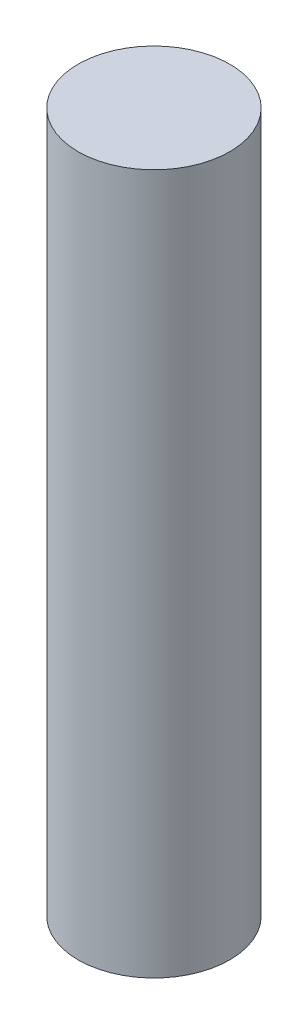
ISO-10303-21;
HEADER;
FILE_DESCRIPTION(('STEP AP214'),'2;1');
FILE_NAME('part.step','',(''),(''),'','','');
FILE_SCHEMA(('AUTOMOTIVE_DESIGN { 1 0 10303 214 1 1 1 1 }'));
ENDSEC;
DATA;
#1=APPLICATION_CONTEXT('core data for automotive mechanical design processes');
#2=APPLICATION_PROTOCOL_DEFINITION('international standard','automotive_design',2000,#1);
#3=PRODUCT_CONTEXT('',#1,'mechanical');
#4=PRODUCT('Part','Part','',(#3));
#5=PRODUCT_RELATED_PRODUCT_CATEGORY('part','',(#4));
#6=PRODUCT_DEFINITION_FORMATION('','',#4);
#7=PRODUCT_DEFINITION_CONTEXT('part definition',#1,'design');
#8=PRODUCT_DEFINITION('design','',#6,#7);
#9=PRODUCT_DEFINITION_SHAPE('','',#8);
#10=(LENGTH_UNIT() NAMED_UNIT(*) SI_UNIT(.MILLI.,.METRE.));
#11=(NAMED_UNIT(*) PLANE_ANGLE_UNIT() SI_UNIT($,.RADIAN.));
#12=(NAMED_UNIT(*) SI_UNIT($,.STERADIAN.) SOLID_ANGLE_UNIT());
#13=UNCERTAINTY_MEASURE_WITH_UNIT(LENGTH_MEASURE(1.E-05),#10,'distance_accuracy_value','');
#14=(GEOMETRIC_REPRESENTATION_CONTEXT(3) GLOBAL_UNCERTAINTY_ASSIGNED_CONTEXT((#13)) GLOBAL_UNIT_ASSIGNED_CONTEXT((#10,
#11,#12)) REPRESENTATION_CONTEXT('',''));
#15=CARTESIAN_POINT('',(0.,0.,0.));
#16=DIRECTION('',(0.,0.,1.));
#17=DIRECTION('',(1.,0.,0.));
#18=AXIS2_PLACEMENT_3D('',#15,#16,#17);
#19=CARTESIAN_POINT('',(0.,30.,0.));
#20=DIRECTION('',(0.,-1.,0.));
#21=DIRECTION('',(0.,0.,-1.));
#22=AXIS2_PLACEMENT_3D('',#19,#20,#21);
#23=CYLINDRICAL_SURFACE('',#22,3.25);
#24=CARTESIAN_POINT('',(0.,30.,0.));
#25=DIRECTION('',(0.,1.,0.));
#26=DIRECTION('',(0.,0.,1.));
#27=AXIS2_PLACEMENT_3D('',#24,#25,#26);
#28=CIRCLE('',#27,3.25);
#29=CARTESIAN_POINT('',(0.,30.,3.25));
#30=VERTEX_POINT('',#29);
#31=EDGE_CURVE('E10',#30,#30,#28,.T.);
#32=ORIENTED_EDGE('',*,*,#31,.F.);
#33=EDGE_LOOP('',(#32));
#34=FACE_BOUND('',#33,.T.);
#35=CARTESIAN_POINT('',(0.,0.,0.));
#36=DIRECTION('',(0.,1.,0.));
#37=DIRECTION('',(0.,0.,1.));
#38=AXIS2_PLACEMENT_3D('',#35,#36,#37);
#39=CIRCLE('',#38,3.25);
#40=CARTESIAN_POINT('',(0.,0.,3.25));
#41=VERTEX_POINT('',#40);
#42=EDGE_CURVE('E34',#41,#41,#39,.T.);
#43=ORIENTED_EDGE('',*,*,#42,.T.);
#44=EDGE_LOOP('',(#43));
#45=FACE_BOUND('',#44,.T.);
#46=ADVANCED_FACE('F31',(#34,#45),#23,.T.);
#47=CARTESIAN_POINT('',(0.,30.,0.));
#48=DIRECTION('',(0.,1.,0.));
#49=DIRECTION('',(0.,0.,1.));
#50=AXIS2_PLACEMENT_3D('',#47,#48,#49);
#51=PLANE('',#50);
#52=ORIENTED_EDGE('',*,*,#31,.T.);
#53=EDGE_LOOP('',(#52));
#54=FACE_BOUND('',#53,.T.);
#55=ADVANCED_FACE('F46',(#54),#51,.T.);
#56=CARTESIAN_POINT('',(0.,0.,0.));
#57=DIRECTION('',(0.,1.,0.));
#58=DIRECTION('',(0.,0.,1.));
#59=AXIS2_PLACEMENT_3D('',#56,#57,#58);
#60=PLANE('',#59);
#61=ORIENTED_EDGE('',*,*,#42,.F.);
#62=EDGE_LOOP('',(#61));
#63=FACE_BOUND('',#62,.T.);
#64=ADVANCED_FACE('F44',(#63),#60,.F.);
#65=CLOSED_SHELL('',(#46,#55,#64));
#66=MANIFOLD_SOLID_BREP('B2',#65);
#67=ADVANCED_BREP_SHAPE_REPRESENTATION('',(#18,#66),#14);
#68=SHAPE_DEFINITION_REPRESENTATION(#9,#67);
ENDSEC;
END-ISO-10303-21;
